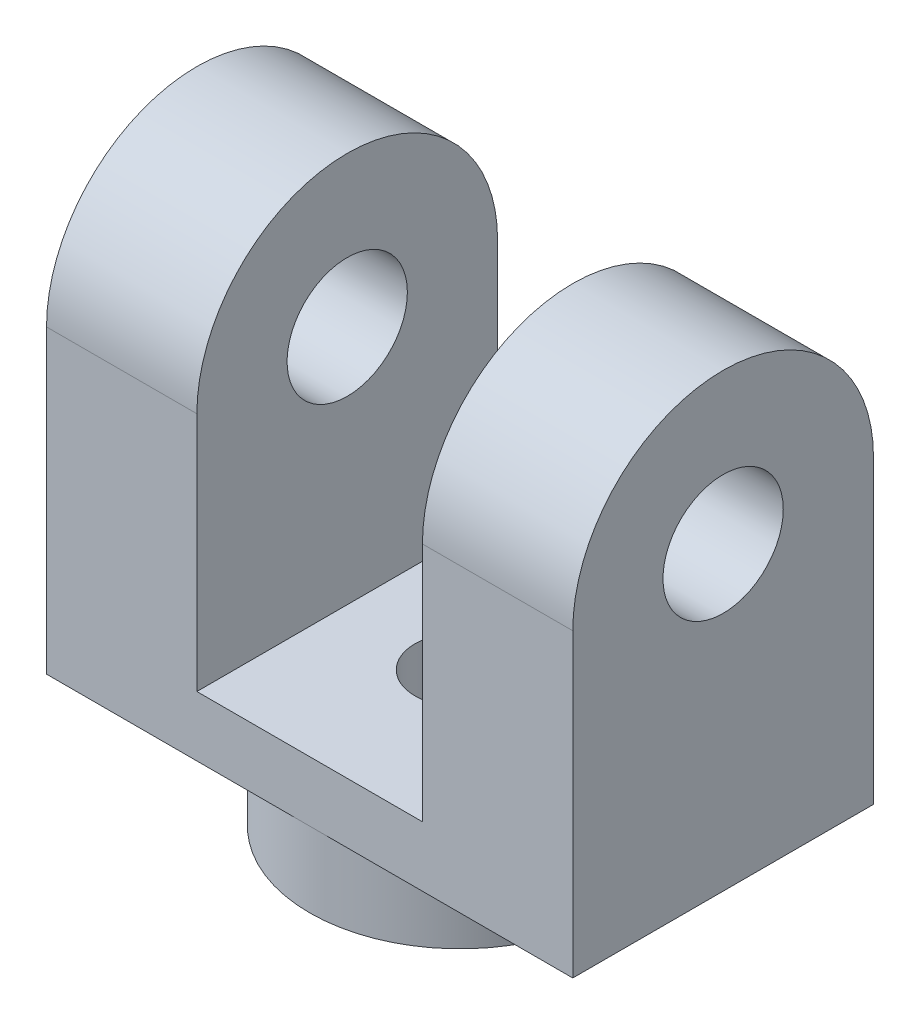
ISO-10303-21;
HEADER;
FILE_DESCRIPTION(('STEP AP214'),'2;1');
FILE_NAME('part.step','',(''),(''),'','','');
FILE_SCHEMA(('AUTOMOTIVE_DESIGN { 1 0 10303 214 1 1 1 1 }'));
ENDSEC;
DATA;
#1=APPLICATION_CONTEXT('core data for automotive mechanical design processes');
#2=APPLICATION_PROTOCOL_DEFINITION('international standard','automotive_design',2000,#1);
#3=PRODUCT_CONTEXT('',#1,'mechanical');
#4=PRODUCT('Part','Part','',(#3));
#5=PRODUCT_RELATED_PRODUCT_CATEGORY('part','',(#4));
#6=PRODUCT_DEFINITION_FORMATION('','',#4);
#7=PRODUCT_DEFINITION_CONTEXT('part definition',#1,'design');
#8=PRODUCT_DEFINITION('design','',#6,#7);
#9=PRODUCT_DEFINITION_SHAPE('','',#8);
#10=(LENGTH_UNIT() NAMED_UNIT(*) SI_UNIT(.MILLI.,.METRE.));
#11=(NAMED_UNIT(*) PLANE_ANGLE_UNIT() SI_UNIT($,.RADIAN.));
#12=(NAMED_UNIT(*) SI_UNIT($,.STERADIAN.) SOLID_ANGLE_UNIT());
#13=UNCERTAINTY_MEASURE_WITH_UNIT(LENGTH_MEASURE(1.E-05),#10,'distance_accuracy_value','');
#14=(GEOMETRIC_REPRESENTATION_CONTEXT(3) GLOBAL_UNCERTAINTY_ASSIGNED_CONTEXT((#13)) GLOBAL_UNIT_ASSIGNED_CONTEXT((#10,
#11,#12)) REPRESENTATION_CONTEXT('',''));
#15=CARTESIAN_POINT('',(0.,0.,0.));
#16=DIRECTION('',(0.,0.,1.));
#17=DIRECTION('',(1.,0.,0.));
#18=AXIS2_PLACEMENT_3D('',#15,#16,#17);
#19=CARTESIAN_POINT('',(87.5,100.,0.));
#20=DIRECTION('',(-1.,0.,0.));
#21=DIRECTION('',(0.,0.,1.));
#22=AXIS2_PLACEMENT_3D('',#19,#20,#21);
#23=CYLINDRICAL_SURFACE('',#22,50.);
#24=CARTESIAN_POINT('',(-37.5,100.,0.));
#25=DIRECTION('',(-1.,0.,0.));
#26=DIRECTION('',(0.,-1.,0.));
#27=AXIS2_PLACEMENT_3D('',#24,#25,#26);
#28=CIRCLE('',#27,50.);
#29=CARTESIAN_POINT('',(-37.5,100.,50.));
#30=VERTEX_POINT('',#29);
#31=CARTESIAN_POINT('',(-37.5,100.,-50.));
#32=VERTEX_POINT('',#31);
#33=EDGE_CURVE('E235',#30,#32,#28,.T.);
#34=ORIENTED_EDGE('',*,*,#33,.T.);
#35=DIRECTION('',(-1.,0.,0.));
#36=VECTOR('',#35,1.);
#37=CARTESIAN_POINT('',(87.5,100.,-50.));
#38=LINE('',#37,#36);
#39=CARTESIAN_POINT('',(-87.5,100.,-50.));
#40=VERTEX_POINT('',#39);
#41=EDGE_CURVE('E143',#32,#40,#38,.T.);
#42=ORIENTED_EDGE('',*,*,#41,.T.);
#43=CARTESIAN_POINT('',(-87.5,100.,0.));
#44=DIRECTION('',(1.,0.,0.));
#45=DIRECTION('',(0.,0.,-1.));
#46=AXIS2_PLACEMENT_3D('',#43,#44,#45);
#47=CIRCLE('',#46,50.);
#48=CARTESIAN_POINT('',(-87.5,100.,50.));
#49=VERTEX_POINT('',#48);
#50=EDGE_CURVE('E217',#40,#49,#47,.T.);
#51=ORIENTED_EDGE('',*,*,#50,.T.);
#52=DIRECTION('',(-1.,0.,0.));
#53=VECTOR('',#52,1.);
#54=CARTESIAN_POINT('',(87.5,100.,50.));
#55=LINE('',#54,#53);
#56=EDGE_CURVE('E160',#30,#49,#55,.T.);
#57=ORIENTED_EDGE('',*,*,#56,.F.);
#58=EDGE_LOOP('',(#34,#42,#51,#57));
#59=FACE_BOUND('',#58,.T.);
#60=ADVANCED_FACE('F49',(#59),#23,.T.);
#61=CARTESIAN_POINT('',(0.,-25.,0.));
#62=DIRECTION('',(0.,1.,0.));
#63=DIRECTION('',(0.,0.,1.));
#64=AXIS2_PLACEMENT_3D('',#61,#62,#63);
#65=CYLINDRICAL_SURFACE('',#64,37.5);
#66=CARTESIAN_POINT('',(0.,-25.,0.));
#67=DIRECTION('',(0.,1.,0.));
#68=DIRECTION('',(0.,0.,1.));
#69=AXIS2_PLACEMENT_3D('',#66,#67,#68);
#70=CIRCLE('',#69,37.5);
#71=CARTESIAN_POINT('',(0.,-25.,37.5));
#72=VERTEX_POINT('',#71);
#73=EDGE_CURVE('E164',#72,#72,#70,.T.);
#74=ORIENTED_EDGE('',*,*,#73,.F.);
#75=EDGE_LOOP('',(#74));
#76=FACE_BOUND('',#75,.T.);
#77=CARTESIAN_POINT('',(0.,0.,0.));
#78=DIRECTION('',(0.,1.,0.));
#79=DIRECTION('',(0.,0.,1.));
#80=AXIS2_PLACEMENT_3D('',#77,#78,#79);
#81=CIRCLE('',#80,37.5);
#82=CARTESIAN_POINT('',(0.,0.,37.5));
#83=VERTEX_POINT('',#82);
#84=EDGE_CURVE('E158',#83,#83,#81,.T.);
#85=ORIENTED_EDGE('',*,*,#84,.T.);
#86=EDGE_LOOP('',(#85));
#87=FACE_BOUND('',#86,.T.);
#88=ADVANCED_FACE('F51',(#76,#87),#65,.F.);
#89=CARTESIAN_POINT('',(0.,-25.,0.));
#90=DIRECTION('',(0.,1.,0.));
#91=DIRECTION('',(0.,0.,1.));
#92=AXIS2_PLACEMENT_3D('',#89,#90,#91);
#93=CYLINDRICAL_SURFACE('',#92,50.);
#94=CARTESIAN_POINT('',(0.,-25.,0.));
#95=DIRECTION('',(0.,1.,0.));
#96=DIRECTION('',(0.,0.,1.));
#97=AXIS2_PLACEMENT_3D('',#94,#95,#96);
#98=CIRCLE('',#97,50.);
#99=CARTESIAN_POINT('',(0.,-25.,50.));
#100=VERTEX_POINT('',#99);
#101=EDGE_CURVE('E59',#100,#100,#98,.T.);
#102=ORIENTED_EDGE('',*,*,#101,.T.);
#103=EDGE_LOOP('',(#102));
#104=FACE_BOUND('',#103,.T.);
#105=CARTESIAN_POINT('',(0.,0.,0.));
#106=DIRECTION('',(0.,1.,0.));
#107=DIRECTION('',(0.,0.,1.));
#108=AXIS2_PLACEMENT_3D('',#105,#106,#107);
#109=CIRCLE('',#108,50.);
#110=CARTESIAN_POINT('',(0.,0.,50.));
#111=VERTEX_POINT('',#110);
#112=CARTESIAN_POINT('',(0.,0.,-50.));
#113=VERTEX_POINT('',#112);
#114=EDGE_CURVE('E168',#111,#113,#109,.T.);
#115=ORIENTED_EDGE('',*,*,#114,.F.);
#116=EDGE_CURVE('E73',#113,#111,#109,.T.);
#117=ORIENTED_EDGE('',*,*,#116,.F.);
#118=EDGE_LOOP('',(#115,#117));
#119=FACE_BOUND('',#118,.T.);
#120=ADVANCED_FACE('F302',(#104,#119),#93,.T.);
#121=CARTESIAN_POINT('',(0.,-25.,0.));
#122=DIRECTION('',(0.,1.,0.));
#123=DIRECTION('',(0.,0.,1.));
#124=AXIS2_PLACEMENT_3D('',#121,#122,#123);
#125=PLANE('',#124);
#126=ORIENTED_EDGE('',*,*,#73,.T.);
#127=EDGE_LOOP('',(#126));
#128=FACE_BOUND('',#127,.T.);
#129=ORIENTED_EDGE('',*,*,#101,.F.);
#130=EDGE_LOOP('',(#129));
#131=FACE_BOUND('',#130,.T.);
#132=ADVANCED_FACE('F335',(#128,#131),#125,.F.);
#133=CARTESIAN_POINT('',(-87.5,100.,0.));
#134=DIRECTION('',(1.,0.,0.));
#135=DIRECTION('',(0.,0.,-1.));
#136=AXIS2_PLACEMENT_3D('',#133,#134,#135);
#137=PLANE('',#136);
#138=CARTESIAN_POINT('',(-87.5,100.,0.));
#139=DIRECTION('',(1.,0.,0.));
#140=DIRECTION('',(0.,0.,-1.));
#141=AXIS2_PLACEMENT_3D('',#138,#139,#140);
#142=CIRCLE('',#141,20.);
#143=CARTESIAN_POINT('',(-87.5,100.,-20.));
#144=VERTEX_POINT('',#143);
#145=EDGE_CURVE('E268',#144,#144,#142,.T.);
#146=ORIENTED_EDGE('',*,*,#145,.T.);
#147=EDGE_LOOP('',(#146));
#148=FACE_BOUND('',#147,.T.);
#149=DIRECTION('',(0.,1.,0.));
#150=VECTOR('',#149,1.);
#151=CARTESIAN_POINT('',(-87.5,0.,-50.));
#152=LINE('',#151,#150);
#153=CARTESIAN_POINT('',(-87.5,0.,-50.));
#154=VERTEX_POINT('',#153);
#155=EDGE_CURVE('E145',#154,#40,#152,.T.);
#156=ORIENTED_EDGE('',*,*,#155,.F.);
#157=DIRECTION('',(0.,0.,-1.));
#158=VECTOR('',#157,1.);
#159=CARTESIAN_POINT('',(-87.5,0.,50.));
#160=LINE('',#159,#158);
#161=CARTESIAN_POINT('',(-87.5,0.,50.));
#162=VERTEX_POINT('',#161);
#163=EDGE_CURVE('E211',#162,#154,#160,.T.);
#164=ORIENTED_EDGE('',*,*,#163,.F.);
#165=DIRECTION('',(0.,-1.,0.));
#166=VECTOR('',#165,1.);
#167=CARTESIAN_POINT('',(-87.5,100.,50.));
#168=LINE('',#167,#166);
#169=EDGE_CURVE('E198',#49,#162,#168,.T.);
#170=ORIENTED_EDGE('',*,*,#169,.F.);
#171=ORIENTED_EDGE('',*,*,#50,.F.);
#172=EDGE_LOOP('',(#156,#164,#170,#171));
#173=FACE_BOUND('',#172,.T.);
#174=ADVANCED_FACE('F331',(#148,#173),#137,.F.);
#175=CARTESIAN_POINT('',(87.5,100.,0.));
#176=DIRECTION('',(1.,0.,0.));
#177=DIRECTION('',(0.,0.,-1.));
#178=AXIS2_PLACEMENT_3D('',#175,#176,#177);
#179=PLANE('',#178);
#180=CARTESIAN_POINT('',(87.5,100.,0.));
#181=DIRECTION('',(1.,0.,0.));
#182=DIRECTION('',(0.,0.,-1.));
#183=AXIS2_PLACEMENT_3D('',#180,#181,#182);
#184=CIRCLE('',#183,20.);
#185=CARTESIAN_POINT('',(87.5,100.,-20.));
#186=VERTEX_POINT('',#185);
#187=EDGE_CURVE('E264',#186,#186,#184,.T.);
#188=ORIENTED_EDGE('',*,*,#187,.F.);
#189=EDGE_LOOP('',(#188));
#190=FACE_BOUND('',#189,.T.);
#191=DIRECTION('',(0.,1.,0.));
#192=VECTOR('',#191,1.);
#193=CARTESIAN_POINT('',(87.5,0.,-50.));
#194=LINE('',#193,#192);
#195=CARTESIAN_POINT('',(87.5,0.,-50.));
#196=VERTEX_POINT('',#195);
#197=CARTESIAN_POINT('',(87.5,100.,-50.));
#198=VERTEX_POINT('',#197);
#199=EDGE_CURVE('E214',#196,#198,#194,.T.);
#200=ORIENTED_EDGE('',*,*,#199,.T.);
#201=CARTESIAN_POINT('',(87.5,100.,0.));
#202=DIRECTION('',(1.,0.,0.));
#203=DIRECTION('',(0.,0.,-1.));
#204=AXIS2_PLACEMENT_3D('',#201,#202,#203);
#205=CIRCLE('',#204,50.);
#206=CARTESIAN_POINT('',(87.5,100.,50.));
#207=VERTEX_POINT('',#206);
#208=EDGE_CURVE('E227',#198,#207,#205,.T.);
#209=ORIENTED_EDGE('',*,*,#208,.T.);
#210=DIRECTION('',(0.,-1.,0.));
#211=VECTOR('',#210,1.);
#212=CARTESIAN_POINT('',(87.5,100.,50.));
#213=LINE('',#212,#211);
#214=CARTESIAN_POINT('',(87.5,0.,50.));
#215=VERTEX_POINT('',#214);
#216=EDGE_CURVE('E224',#207,#215,#213,.T.);
#217=ORIENTED_EDGE('',*,*,#216,.T.);
#218=DIRECTION('',(0.,0.,-1.));
#219=VECTOR('',#218,1.);
#220=CARTESIAN_POINT('',(87.5,0.,50.));
#221=LINE('',#220,#219);
#222=EDGE_CURVE('E203',#215,#196,#221,.T.);
#223=ORIENTED_EDGE('',*,*,#222,.T.);
#224=EDGE_LOOP('',(#200,#209,#217,#223));
#225=FACE_BOUND('',#224,.T.);
#226=ADVANCED_FACE('F312',(#190,#225),#179,.T.);
#227=CARTESIAN_POINT('',(87.5,100.,50.));
#228=DIRECTION('',(0.,0.,-1.));
#229=DIRECTION('',(0.,1.,0.));
#230=AXIS2_PLACEMENT_3D('',#227,#228,#229);
#231=PLANE('',#230);
#232=DIRECTION('',(-1.,0.,0.));
#233=VECTOR('',#232,1.);
#234=CARTESIAN_POINT('',(87.5,20.,50.));
#235=LINE('',#234,#233);
#236=CARTESIAN_POINT('',(37.5,20.,50.));
#237=VERTEX_POINT('',#236);
#238=CARTESIAN_POINT('',(-37.5,20.,50.));
#239=VERTEX_POINT('',#238);
#240=EDGE_CURVE('E246',#237,#239,#235,.T.);
#241=ORIENTED_EDGE('',*,*,#240,.T.);
#242=DIRECTION('',(0.,1.,0.));
#243=VECTOR('',#242,1.);
#244=CARTESIAN_POINT('',(-37.5,100.,50.));
#245=LINE('',#244,#243);
#246=EDGE_CURVE('E128',#239,#30,#245,.T.);
#247=ORIENTED_EDGE('',*,*,#246,.T.);
#248=ORIENTED_EDGE('',*,*,#56,.T.);
#249=ORIENTED_EDGE('',*,*,#169,.T.);
#250=DIRECTION('',(-1.,0.,0.));
#251=VECTOR('',#250,1.);
#252=CARTESIAN_POINT('',(87.5,0.,50.));
#253=LINE('',#252,#251);
#254=EDGE_CURVE('E187',#111,#162,#253,.T.);
#255=ORIENTED_EDGE('',*,*,#254,.F.);
#256=EDGE_CURVE('E195',#215,#111,#253,.T.);
#257=ORIENTED_EDGE('',*,*,#256,.F.);
#258=ORIENTED_EDGE('',*,*,#216,.F.);
#259=CARTESIAN_POINT('',(37.5,100.,50.));
#260=VERTEX_POINT('',#259);
#261=EDGE_CURVE('E151',#207,#260,#55,.T.);
#262=ORIENTED_EDGE('',*,*,#261,.T.);
#263=DIRECTION('',(0.,-1.,0.));
#264=VECTOR('',#263,1.);
#265=CARTESIAN_POINT('',(37.5,100.,50.));
#266=LINE('',#265,#264);
#267=EDGE_CURVE('E238',#260,#237,#266,.T.);
#268=ORIENTED_EDGE('',*,*,#267,.T.);
#269=EDGE_LOOP('',(#241,#247,#248,#249,#255,#257,#258,#262,#268));
#270=FACE_BOUND('',#269,.T.);
#271=ADVANCED_FACE('F193',(#270),#231,.F.);
#272=CARTESIAN_POINT('',(37.5,100.,-50.));
#273=VERTEX_POINT('',#272);
#274=EDGE_CURVE('E150',#198,#273,#38,.T.);
#275=ORIENTED_EDGE('',*,*,#274,.T.);
#276=CARTESIAN_POINT('',(37.5,100.,0.));
#277=DIRECTION('',(1.,0.,0.));
#278=DIRECTION('',(0.,1.,0.));
#279=AXIS2_PLACEMENT_3D('',#276,#277,#278);
#280=CIRCLE('',#279,50.);
#281=EDGE_CURVE('E242',#273,#260,#280,.T.);
#282=ORIENTED_EDGE('',*,*,#281,.T.);
#283=ORIENTED_EDGE('',*,*,#261,.F.);
#284=ORIENTED_EDGE('',*,*,#208,.F.);
#285=EDGE_LOOP('',(#275,#282,#283,#284));
#286=FACE_BOUND('',#285,.T.);
#287=ADVANCED_FACE('F298',(#286),#23,.T.);
#288=CARTESIAN_POINT('',(87.5,0.,-50.));
#289=DIRECTION('',(0.,0.,1.));
#290=DIRECTION('',(1.,0.,0.));
#291=AXIS2_PLACEMENT_3D('',#288,#289,#290);
#292=PLANE('',#291);
#293=ORIENTED_EDGE('',*,*,#41,.F.);
#294=DIRECTION('',(0.,-1.,0.));
#295=VECTOR('',#294,1.);
#296=CARTESIAN_POINT('',(-37.5,0.,-50.));
#297=LINE('',#296,#295);
#298=CARTESIAN_POINT('',(-37.5,20.,-50.));
#299=VERTEX_POINT('',#298);
#300=EDGE_CURVE('E11',#32,#299,#297,.T.);
#301=ORIENTED_EDGE('',*,*,#300,.T.);
#302=DIRECTION('',(1.,0.,0.));
#303=VECTOR('',#302,1.);
#304=CARTESIAN_POINT('',(-37.5,20.,-50.));
#305=LINE('',#304,#303);
#306=CARTESIAN_POINT('',(37.5,20.,-50.));
#307=VERTEX_POINT('',#306);
#308=EDGE_CURVE('E135',#299,#307,#305,.T.);
#309=ORIENTED_EDGE('',*,*,#308,.T.);
#310=DIRECTION('',(0.,1.,0.));
#311=VECTOR('',#310,1.);
#312=CARTESIAN_POINT('',(37.5,150.,-50.));
#313=LINE('',#312,#311);
#314=EDGE_CURVE('E66',#307,#273,#313,.T.);
#315=ORIENTED_EDGE('',*,*,#314,.T.);
#316=ORIENTED_EDGE('',*,*,#274,.F.);
#317=ORIENTED_EDGE('',*,*,#199,.F.);
#318=DIRECTION('',(-1.,0.,0.));
#319=VECTOR('',#318,1.);
#320=CARTESIAN_POINT('',(87.5,0.,-50.));
#321=LINE('',#320,#319);
#322=EDGE_CURVE('E201',#196,#113,#321,.T.);
#323=ORIENTED_EDGE('',*,*,#322,.T.);
#324=EDGE_CURVE('E189',#113,#154,#321,.T.);
#325=ORIENTED_EDGE('',*,*,#324,.T.);
#326=ORIENTED_EDGE('',*,*,#155,.T.);
#327=EDGE_LOOP('',(#293,#301,#309,#315,#316,#317,#323,#325,#326));
#328=FACE_BOUND('',#327,.T.);
#329=ADVANCED_FACE('F141',(#328),#292,.F.);
#330=CARTESIAN_POINT('',(87.5,0.,50.));
#331=DIRECTION('',(0.,1.,0.));
#332=DIRECTION('',(0.,0.,1.));
#333=AXIS2_PLACEMENT_3D('',#330,#331,#332);
#334=PLANE('',#333);
#335=ORIENTED_EDGE('',*,*,#324,.F.);
#336=ORIENTED_EDGE('',*,*,#116,.T.);
#337=ORIENTED_EDGE('',*,*,#254,.T.);
#338=ORIENTED_EDGE('',*,*,#163,.T.);
#339=EDGE_LOOP('',(#335,#336,#337,#338));
#340=FACE_BOUND('',#339,.T.);
#341=ADVANCED_FACE('F185',(#340),#334,.F.);
#342=ORIENTED_EDGE('',*,*,#256,.T.);
#343=ORIENTED_EDGE('',*,*,#114,.T.);
#344=ORIENTED_EDGE('',*,*,#322,.F.);
#345=ORIENTED_EDGE('',*,*,#222,.F.);
#346=EDGE_LOOP('',(#342,#343,#344,#345));
#347=FACE_BOUND('',#346,.T.);
#348=ADVANCED_FACE('F202',(#347),#334,.F.);
#349=CARTESIAN_POINT('',(0.,0.,0.));
#350=DIRECTION('',(0.,1.,0.));
#351=DIRECTION('',(0.,0.,1.));
#352=AXIS2_PLACEMENT_3D('',#349,#350,#351);
#353=CIRCLE('',#352,15.);
#354=CARTESIAN_POINT('',(0.,0.,15.));
#355=VERTEX_POINT('',#354);
#356=EDGE_CURVE('E139',#355,#355,#353,.T.);
#357=ORIENTED_EDGE('',*,*,#356,.T.);
#358=EDGE_LOOP('',(#357));
#359=FACE_BOUND('',#358,.T.);
#360=ORIENTED_EDGE('',*,*,#84,.F.);
#361=EDGE_LOOP('',(#360));
#362=FACE_BOUND('',#361,.T.);
#363=ADVANCED_FACE('F325',(#359,#362),#334,.F.);
#364=CARTESIAN_POINT('',(-37.5,150.,-50.));
#365=DIRECTION('',(-1.,0.,0.));
#366=DIRECTION('',(0.,-1.,0.));
#367=AXIS2_PLACEMENT_3D('',#364,#365,#366);
#368=PLANE('',#367);
#369=CARTESIAN_POINT('',(-37.5,100.,0.));
#370=DIRECTION('',(-1.,0.,0.));
#371=DIRECTION('',(0.,-1.,0.));
#372=AXIS2_PLACEMENT_3D('',#369,#370,#371);
#373=CIRCLE('',#372,20.);
#374=CARTESIAN_POINT('',(-37.5,80.,0.));
#375=VERTEX_POINT('',#374);
#376=EDGE_CURVE('E260',#375,#375,#373,.T.);
#377=ORIENTED_EDGE('',*,*,#376,.T.);
#378=EDGE_LOOP('',(#377));
#379=FACE_BOUND('',#378,.T.);
#380=DIRECTION('',(0.,0.,1.));
#381=VECTOR('',#380,1.);
#382=CARTESIAN_POINT('',(-37.5,20.,-50.));
#383=LINE('',#382,#381);
#384=EDGE_CURVE('E123',#299,#239,#383,.T.);
#385=ORIENTED_EDGE('',*,*,#384,.F.);
#386=ORIENTED_EDGE('',*,*,#300,.F.);
#387=ORIENTED_EDGE('',*,*,#33,.F.);
#388=ORIENTED_EDGE('',*,*,#246,.F.);
#389=EDGE_LOOP('',(#385,#386,#387,#388));
#390=FACE_BOUND('',#389,.T.);
#391=ADVANCED_FACE('F125',(#379,#390),#368,.F.);
#392=CARTESIAN_POINT('',(37.5,150.,-50.));
#393=DIRECTION('',(1.,0.,0.));
#394=DIRECTION('',(0.,1.,0.));
#395=AXIS2_PLACEMENT_3D('',#392,#393,#394);
#396=PLANE('',#395);
#397=CARTESIAN_POINT('',(37.5,100.,0.));
#398=DIRECTION('',(1.,0.,0.));
#399=DIRECTION('',(0.,1.,0.));
#400=AXIS2_PLACEMENT_3D('',#397,#398,#399);
#401=CIRCLE('',#400,20.);
#402=CARTESIAN_POINT('',(37.5,120.,0.));
#403=VERTEX_POINT('',#402);
#404=EDGE_CURVE('E53',#403,#403,#401,.T.);
#405=ORIENTED_EDGE('',*,*,#404,.T.);
#406=EDGE_LOOP('',(#405));
#407=FACE_BOUND('',#406,.T.);
#408=ORIENTED_EDGE('',*,*,#281,.F.);
#409=ORIENTED_EDGE('',*,*,#314,.F.);
#410=DIRECTION('',(0.,0.,1.));
#411=VECTOR('',#410,1.);
#412=CARTESIAN_POINT('',(37.5,20.,-50.));
#413=LINE('',#412,#411);
#414=EDGE_CURVE('E132',#307,#237,#413,.T.);
#415=ORIENTED_EDGE('',*,*,#414,.T.);
#416=ORIENTED_EDGE('',*,*,#267,.F.);
#417=EDGE_LOOP('',(#408,#409,#415,#416));
#418=FACE_BOUND('',#417,.T.);
#419=ADVANCED_FACE('F281',(#407,#418),#396,.F.);
#420=CARTESIAN_POINT('',(-37.5,20.,-50.));
#421=DIRECTION('',(0.,-1.,0.));
#422=DIRECTION('',(1.,0.,0.));
#423=AXIS2_PLACEMENT_3D('',#420,#421,#422);
#424=PLANE('',#423);
#425=CARTESIAN_POINT('',(0.,20.,0.));
#426=DIRECTION('',(0.,1.,0.));
#427=DIRECTION('',(-1.,0.,0.));
#428=AXIS2_PLACEMENT_3D('',#425,#426,#427);
#429=CIRCLE('',#428,15.);
#430=CARTESIAN_POINT('',(-15.,20.,0.));
#431=VERTEX_POINT('',#430);
#432=EDGE_CURVE('E256',#431,#431,#429,.T.);
#433=ORIENTED_EDGE('',*,*,#432,.F.);
#434=EDGE_LOOP('',(#433));
#435=FACE_BOUND('',#434,.T.);
#436=ORIENTED_EDGE('',*,*,#414,.F.);
#437=ORIENTED_EDGE('',*,*,#308,.F.);
#438=ORIENTED_EDGE('',*,*,#384,.T.);
#439=ORIENTED_EDGE('',*,*,#240,.F.);
#440=EDGE_LOOP('',(#436,#437,#438,#439));
#441=FACE_BOUND('',#440,.T.);
#442=ADVANCED_FACE('F136',(#435,#441),#424,.F.);
#443=CARTESIAN_POINT('',(0.,-25.,0.));
#444=DIRECTION('',(0.,1.,0.));
#445=DIRECTION('',(-1.,0.,0.));
#446=AXIS2_PLACEMENT_3D('',#443,#444,#445);
#447=CYLINDRICAL_SURFACE('',#446,15.);
#448=ORIENTED_EDGE('',*,*,#432,.T.);
#449=EDGE_LOOP('',(#448));
#450=FACE_BOUND('',#449,.T.);
#451=ORIENTED_EDGE('',*,*,#356,.F.);
#452=EDGE_LOOP('',(#451));
#453=FACE_BOUND('',#452,.T.);
#454=ADVANCED_FACE('F286',(#450,#453),#447,.F.);
#455=CARTESIAN_POINT('',(-87.5,100.,0.));
#456=DIRECTION('',(1.,0.,0.));
#457=DIRECTION('',(0.,0.,-1.));
#458=AXIS2_PLACEMENT_3D('',#455,#456,#457);
#459=CYLINDRICAL_SURFACE('',#458,20.);
#460=ORIENTED_EDGE('',*,*,#187,.T.);
#461=EDGE_LOOP('',(#460));
#462=FACE_BOUND('',#461,.T.);
#463=ORIENTED_EDGE('',*,*,#404,.F.);
#464=EDGE_LOOP('',(#463));
#465=FACE_BOUND('',#464,.T.);
#466=ADVANCED_FACE('F283',(#462,#465),#459,.F.);
#467=ORIENTED_EDGE('',*,*,#145,.F.);
#468=EDGE_LOOP('',(#467));
#469=FACE_BOUND('',#468,.T.);
#470=ORIENTED_EDGE('',*,*,#376,.F.);
#471=EDGE_LOOP('',(#470));
#472=FACE_BOUND('',#471,.T.);
#473=ADVANCED_FACE('F285',(#469,#472),#459,.F.);
#474=CLOSED_SHELL('',(#60,#88,#120,#132,#174,#226,#271,#287,#329,#341,#348,#363,#391,#419,#442,
#454,#466,#473));
#475=MANIFOLD_SOLID_BREP('B2',#474);
#476=ADVANCED_BREP_SHAPE_REPRESENTATION('',(#18,#475),#14);
#477=SHAPE_DEFINITION_REPRESENTATION(#9,#476);
ENDSEC;
END-ISO-10303-21;
